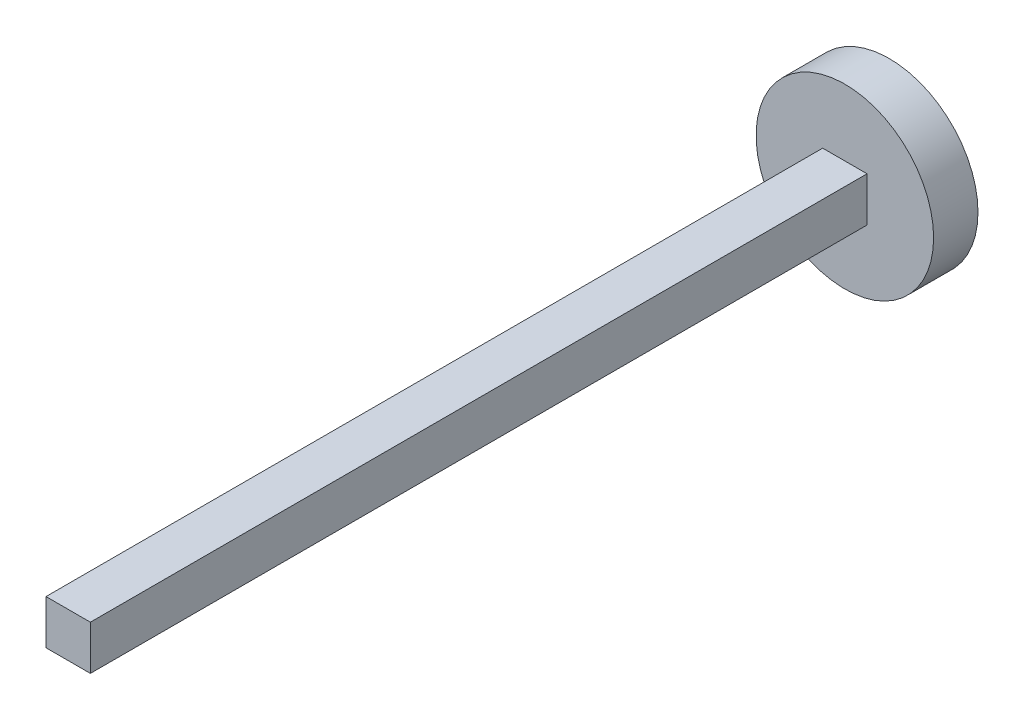
ISO-10303-21;
HEADER;
FILE_DESCRIPTION(('STEP AP214'),'2;1');
FILE_NAME('part.step','',(''),(''),'','','');
FILE_SCHEMA(('AUTOMOTIVE_DESIGN { 1 0 10303 214 1 1 1 1 }'));
ENDSEC;
DATA;
#1=APPLICATION_CONTEXT('core data for automotive mechanical design processes');
#2=APPLICATION_PROTOCOL_DEFINITION('international standard','automotive_design',2000,#1);
#3=PRODUCT_CONTEXT('',#1,'mechanical');
#4=PRODUCT('Part','Part','',(#3));
#5=PRODUCT_RELATED_PRODUCT_CATEGORY('part','',(#4));
#6=PRODUCT_DEFINITION_FORMATION('','',#4);
#7=PRODUCT_DEFINITION_CONTEXT('part definition',#1,'design');
#8=PRODUCT_DEFINITION('design','',#6,#7);
#9=PRODUCT_DEFINITION_SHAPE('','',#8);
#10=(LENGTH_UNIT() NAMED_UNIT(*) SI_UNIT(.MILLI.,.METRE.));
#11=(NAMED_UNIT(*) PLANE_ANGLE_UNIT() SI_UNIT($,.RADIAN.));
#12=(NAMED_UNIT(*) SI_UNIT($,.STERADIAN.) SOLID_ANGLE_UNIT());
#13=UNCERTAINTY_MEASURE_WITH_UNIT(LENGTH_MEASURE(1.E-05),#10,'distance_accuracy_value','');
#14=(GEOMETRIC_REPRESENTATION_CONTEXT(3) GLOBAL_UNCERTAINTY_ASSIGNED_CONTEXT((#13)) GLOBAL_UNIT_ASSIGNED_CONTEXT((#10,
#11,#12)) REPRESENTATION_CONTEXT('',''));
#15=CARTESIAN_POINT('',(0.,0.,0.));
#16=DIRECTION('',(0.,0.,1.));
#17=DIRECTION('',(1.,0.,0.));
#18=AXIS2_PLACEMENT_3D('',#15,#16,#17);
#19=CARTESIAN_POINT('',(0.,0.,20.));
#20=DIRECTION('',(0.,0.,-1.));
#21=DIRECTION('',(-1.,0.,0.));
#22=AXIS2_PLACEMENT_3D('',#19,#20,#21);
#23=CYLINDRICAL_SURFACE('',#22,40.);
#24=CARTESIAN_POINT('',(0.,0.,20.));
#25=DIRECTION('',(0.,0.,1.));
#26=DIRECTION('',(1.,0.,0.));
#27=AXIS2_PLACEMENT_3D('',#24,#25,#26);
#28=CIRCLE('',#27,40.);
#29=CARTESIAN_POINT('',(40.,0.,20.));
#30=VERTEX_POINT('',#29);
#31=EDGE_CURVE('E11',#30,#30,#28,.T.);
#32=ORIENTED_EDGE('',*,*,#31,.F.);
#33=EDGE_LOOP('',(#32));
#34=FACE_BOUND('',#33,.T.);
#35=CARTESIAN_POINT('',(0.,0.,0.));
#36=DIRECTION('',(0.,0.,1.));
#37=DIRECTION('',(1.,0.,0.));
#38=AXIS2_PLACEMENT_3D('',#35,#36,#37);
#39=CIRCLE('',#38,40.);
#40=CARTESIAN_POINT('',(40.,0.,0.));
#41=VERTEX_POINT('',#40);
#42=EDGE_CURVE('E42',#41,#41,#39,.T.);
#43=ORIENTED_EDGE('',*,*,#42,.T.);
#44=EDGE_LOOP('',(#43));
#45=FACE_BOUND('',#44,.T.);
#46=ADVANCED_FACE('F39',(#34,#45),#23,.T.);
#47=CARTESIAN_POINT('',(0.,0.,20.));
#48=DIRECTION('',(0.,0.,1.));
#49=DIRECTION('',(1.,0.,0.));
#50=AXIS2_PLACEMENT_3D('',#47,#48,#49);
#51=PLANE('',#50);
#52=DIRECTION('',(0.,1.,0.));
#53=VECTOR('',#52,1.);
#54=CARTESIAN_POINT('',(10.,-10.,20.));
#55=LINE('',#54,#53);
#56=CARTESIAN_POINT('',(10.,-10.,20.));
#57=VERTEX_POINT('',#56);
#58=CARTESIAN_POINT('',(10.,10.,20.));
#59=VERTEX_POINT('',#58);
#60=EDGE_CURVE('E54',#57,#59,#55,.T.);
#61=ORIENTED_EDGE('',*,*,#60,.F.);
#62=DIRECTION('',(1.,0.,0.));
#63=VECTOR('',#62,1.);
#64=CARTESIAN_POINT('',(-10.,-10.,20.));
#65=LINE('',#64,#63);
#66=CARTESIAN_POINT('',(-10.,-10.,20.));
#67=VERTEX_POINT('',#66);
#68=EDGE_CURVE('E58',#67,#57,#65,.T.);
#69=ORIENTED_EDGE('',*,*,#68,.F.);
#70=DIRECTION('',(0.,-1.,0.));
#71=VECTOR('',#70,1.);
#72=CARTESIAN_POINT('',(-10.,-10.,20.));
#73=LINE('',#72,#71);
#74=CARTESIAN_POINT('',(-10.,10.,20.));
#75=VERTEX_POINT('',#74);
#76=EDGE_CURVE('E118',#75,#67,#73,.T.);
#77=ORIENTED_EDGE('',*,*,#76,.F.);
#78=DIRECTION('',(-1.,0.,0.));
#79=VECTOR('',#78,1.);
#80=CARTESIAN_POINT('',(-10.,10.,20.));
#81=LINE('',#80,#79);
#82=EDGE_CURVE('E121',#59,#75,#81,.T.);
#83=ORIENTED_EDGE('',*,*,#82,.F.);
#84=EDGE_LOOP('',(#61,#69,#77,#83));
#85=FACE_BOUND('',#84,.T.);
#86=ORIENTED_EDGE('',*,*,#31,.T.);
#87=EDGE_LOOP('',(#86));
#88=FACE_BOUND('',#87,.T.);
#89=ADVANCED_FACE('F143',(#85,#88),#51,.T.);
#90=CARTESIAN_POINT('',(0.,0.,0.));
#91=DIRECTION('',(0.,0.,1.));
#92=DIRECTION('',(1.,0.,0.));
#93=AXIS2_PLACEMENT_3D('',#90,#91,#92);
#94=PLANE('',#93);
#95=ORIENTED_EDGE('',*,*,#42,.F.);
#96=EDGE_LOOP('',(#95));
#97=FACE_BOUND('',#96,.T.);
#98=ADVANCED_FACE('F148',(#97),#94,.F.);
#99=CARTESIAN_POINT('',(10.,-10.,370.));
#100=DIRECTION('',(-1.,0.,0.));
#101=DIRECTION('',(0.,0.,1.));
#102=AXIS2_PLACEMENT_3D('',#99,#100,#101);
#103=PLANE('',#102);
#104=ORIENTED_EDGE('',*,*,#60,.T.);
#105=DIRECTION('',(0.,0.,-1.));
#106=VECTOR('',#105,1.);
#107=CARTESIAN_POINT('',(10.,10.,370.));
#108=LINE('',#107,#106);
#109=CARTESIAN_POINT('',(10.,10.,370.));
#110=VERTEX_POINT('',#109);
#111=EDGE_CURVE('E83',#110,#59,#108,.T.);
#112=ORIENTED_EDGE('',*,*,#111,.F.);
#113=DIRECTION('',(0.,1.,0.));
#114=VECTOR('',#113,1.);
#115=CARTESIAN_POINT('',(10.,-10.,370.));
#116=LINE('',#115,#114);
#117=CARTESIAN_POINT('',(10.,-10.,370.));
#118=VERTEX_POINT('',#117);
#119=EDGE_CURVE('E90',#118,#110,#116,.T.);
#120=ORIENTED_EDGE('',*,*,#119,.F.);
#121=DIRECTION('',(0.,0.,-1.));
#122=VECTOR('',#121,1.);
#123=CARTESIAN_POINT('',(10.,-10.,370.));
#124=LINE('',#123,#122);
#125=EDGE_CURVE('E113',#118,#57,#124,.T.);
#126=ORIENTED_EDGE('',*,*,#125,.T.);
#127=EDGE_LOOP('',(#104,#112,#120,#126));
#128=FACE_BOUND('',#127,.T.);
#129=ADVANCED_FACE('F101',(#128),#103,.F.);
#130=CARTESIAN_POINT('',(-10.,10.,370.));
#131=DIRECTION('',(0.,-1.,0.));
#132=DIRECTION('',(0.,0.,-1.));
#133=AXIS2_PLACEMENT_3D('',#130,#131,#132);
#134=PLANE('',#133);
#135=ORIENTED_EDGE('',*,*,#82,.T.);
#136=DIRECTION('',(0.,0.,-1.));
#137=VECTOR('',#136,1.);
#138=CARTESIAN_POINT('',(-10.,10.,370.));
#139=LINE('',#138,#137);
#140=CARTESIAN_POINT('',(-10.,10.,370.));
#141=VERTEX_POINT('',#140);
#142=EDGE_CURVE('E85',#141,#75,#139,.T.);
#143=ORIENTED_EDGE('',*,*,#142,.F.);
#144=DIRECTION('',(-1.,0.,0.));
#145=VECTOR('',#144,1.);
#146=CARTESIAN_POINT('',(-10.,10.,370.));
#147=LINE('',#146,#145);
#148=EDGE_CURVE('E78',#110,#141,#147,.T.);
#149=ORIENTED_EDGE('',*,*,#148,.F.);
#150=ORIENTED_EDGE('',*,*,#111,.T.);
#151=EDGE_LOOP('',(#135,#143,#149,#150));
#152=FACE_BOUND('',#151,.T.);
#153=ADVANCED_FACE('F81',(#152),#134,.F.);
#154=CARTESIAN_POINT('',(-10.,-10.,370.));
#155=DIRECTION('',(1.,0.,0.));
#156=DIRECTION('',(0.,0.,-1.));
#157=AXIS2_PLACEMENT_3D('',#154,#155,#156);
#158=PLANE('',#157);
#159=ORIENTED_EDGE('',*,*,#76,.T.);
#160=DIRECTION('',(0.,0.,-1.));
#161=VECTOR('',#160,1.);
#162=CARTESIAN_POINT('',(-10.,-10.,370.));
#163=LINE('',#162,#161);
#164=CARTESIAN_POINT('',(-10.,-10.,370.));
#165=VERTEX_POINT('',#164);
#166=EDGE_CURVE('E107',#165,#67,#163,.T.);
#167=ORIENTED_EDGE('',*,*,#166,.F.);
#168=DIRECTION('',(0.,-1.,0.));
#169=VECTOR('',#168,1.);
#170=CARTESIAN_POINT('',(-10.,-10.,370.));
#171=LINE('',#170,#169);
#172=EDGE_CURVE('E89',#141,#165,#171,.T.);
#173=ORIENTED_EDGE('',*,*,#172,.F.);
#174=ORIENTED_EDGE('',*,*,#142,.T.);
#175=EDGE_LOOP('',(#159,#167,#173,#174));
#176=FACE_BOUND('',#175,.T.);
#177=ADVANCED_FACE('F131',(#176),#158,.F.);
#178=CARTESIAN_POINT('',(-10.,-10.,370.));
#179=DIRECTION('',(0.,1.,0.));
#180=DIRECTION('',(0.,0.,1.));
#181=AXIS2_PLACEMENT_3D('',#178,#179,#180);
#182=PLANE('',#181);
#183=ORIENTED_EDGE('',*,*,#68,.T.);
#184=ORIENTED_EDGE('',*,*,#125,.F.);
#185=DIRECTION('',(1.,0.,0.));
#186=VECTOR('',#185,1.);
#187=CARTESIAN_POINT('',(-10.,-10.,370.));
#188=LINE('',#187,#186);
#189=EDGE_CURVE('E95',#165,#118,#188,.T.);
#190=ORIENTED_EDGE('',*,*,#189,.F.);
#191=ORIENTED_EDGE('',*,*,#166,.T.);
#192=EDGE_LOOP('',(#183,#184,#190,#191));
#193=FACE_BOUND('',#192,.T.);
#194=ADVANCED_FACE('F133',(#193),#182,.F.);
#195=CARTESIAN_POINT('',(0.,0.,370.));
#196=DIRECTION('',(0.,0.,-1.));
#197=DIRECTION('',(-1.,0.,0.));
#198=AXIS2_PLACEMENT_3D('',#195,#196,#197);
#199=PLANE('',#198);
#200=ORIENTED_EDGE('',*,*,#119,.T.);
#201=ORIENTED_EDGE('',*,*,#148,.T.);
#202=ORIENTED_EDGE('',*,*,#172,.T.);
#203=ORIENTED_EDGE('',*,*,#189,.T.);
#204=EDGE_LOOP('',(#200,#201,#202,#203));
#205=FACE_BOUND('',#204,.T.);
#206=ADVANCED_FACE('F93',(#205),#199,.F.);
#207=CLOSED_SHELL('',(#46,#89,#98,#129,#153,#177,#194,#206));
#208=MANIFOLD_SOLID_BREP('B2',#207);
#209=ADVANCED_BREP_SHAPE_REPRESENTATION('',(#18,#208),#14);
#210=SHAPE_DEFINITION_REPRESENTATION(#9,#209);
ENDSEC;
END-ISO-10303-21;
